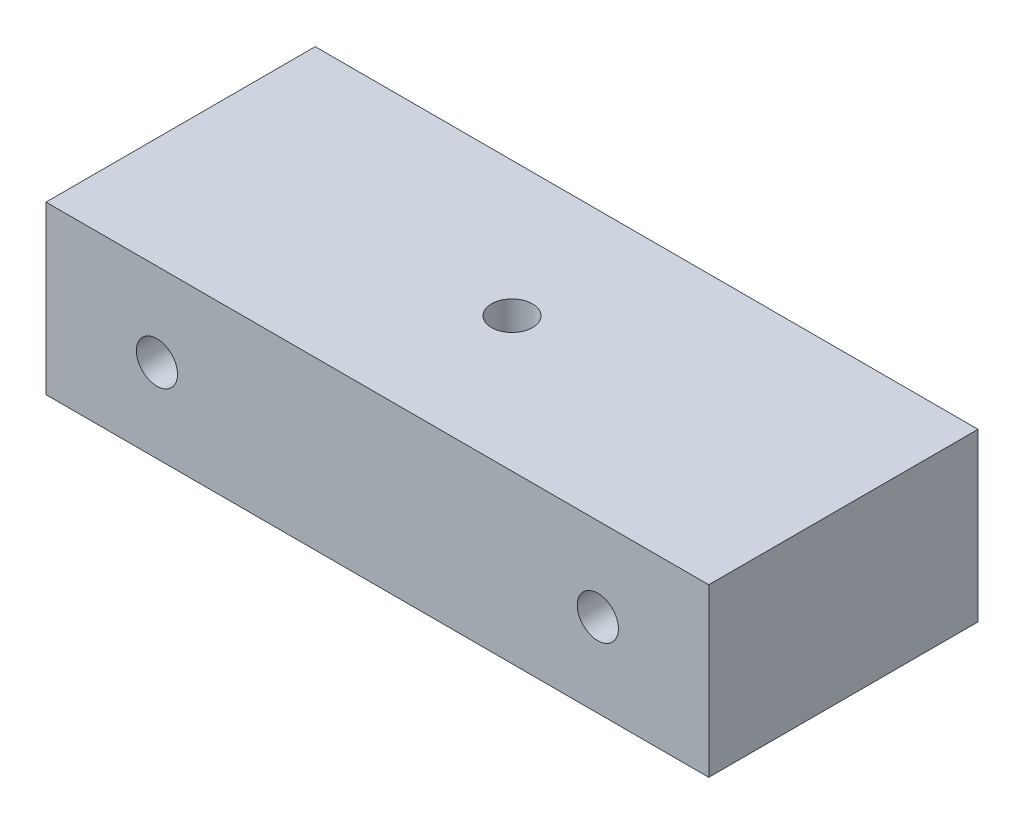
ISO-10303-21;
HEADER;
FILE_DESCRIPTION(('STEP AP214'),'2;1');
FILE_NAME('part.step','',(''),(''),'','','');
FILE_SCHEMA(('AUTOMOTIVE_DESIGN { 1 0 10303 214 1 1 1 1 }'));
ENDSEC;
DATA;
#1=APPLICATION_CONTEXT('core data for automotive mechanical design processes');
#2=APPLICATION_PROTOCOL_DEFINITION('international standard','automotive_design',2000,#1);
#3=PRODUCT_CONTEXT('',#1,'mechanical');
#4=PRODUCT('Part','Part','',(#3));
#5=PRODUCT_RELATED_PRODUCT_CATEGORY('part','',(#4));
#6=PRODUCT_DEFINITION_FORMATION('','',#4);
#7=PRODUCT_DEFINITION_CONTEXT('part definition',#1,'design');
#8=PRODUCT_DEFINITION('design','',#6,#7);
#9=PRODUCT_DEFINITION_SHAPE('','',#8);
#10=(LENGTH_UNIT() NAMED_UNIT(*) SI_UNIT(.MILLI.,.METRE.));
#11=(NAMED_UNIT(*) PLANE_ANGLE_UNIT() SI_UNIT($,.RADIAN.));
#12=(NAMED_UNIT(*) SI_UNIT($,.STERADIAN.) SOLID_ANGLE_UNIT());
#13=UNCERTAINTY_MEASURE_WITH_UNIT(LENGTH_MEASURE(1.E-05),#10,'distance_accuracy_value','');
#14=(GEOMETRIC_REPRESENTATION_CONTEXT(3) GLOBAL_UNCERTAINTY_ASSIGNED_CONTEXT((#13)) GLOBAL_UNIT_ASSIGNED_CONTEXT((#10,
#11,#12)) REPRESENTATION_CONTEXT('',''));
#15=CARTESIAN_POINT('',(0.,0.,0.));
#16=DIRECTION('',(0.,0.,1.));
#17=DIRECTION('',(1.,0.,0.));
#18=AXIS2_PLACEMENT_3D('',#15,#16,#17);
#19=CARTESIAN_POINT('',(60.6717006100665,-154.017379901003,64.8762630190816));
#20=DIRECTION('',(-1.,0.,0.));
#21=DIRECTION('',(0.,0.,1.));
#22=AXIS2_PLACEMENT_3D('',#19,#20,#21);
#23=PLANE('',#22);
#24=DIRECTION('',(0.,1.,0.));
#25=VECTOR('',#24,1.);
#26=CARTESIAN_POINT('',(60.6717006100665,-154.017379901003,18.3699999999998));
#27=LINE('',#26,#25);
#28=CARTESIAN_POINT('',(60.6717006100665,-155.517379901003,18.3699999999998));
#29=VERTEX_POINT('',#28);
#30=CARTESIAN_POINT('',(60.6717006100665,-144.167379901003,18.3699999999998));
#31=VERTEX_POINT('',#30);
#32=EDGE_CURVE('E87',#29,#31,#27,.T.);
#33=ORIENTED_EDGE('',*,*,#32,.F.);
#34=DIRECTION('',(0.,0.,-1.));
#35=VECTOR('',#34,1.);
#36=CARTESIAN_POINT('',(60.6717006100665,-155.517379901003,64.8762630190816));
#37=LINE('',#36,#35);
#38=CARTESIAN_POINT('',(60.6717006100665,-155.517379901003,0.05));
#39=VERTEX_POINT('',#38);
#40=EDGE_CURVE('E53',#29,#39,#37,.T.);
#41=ORIENTED_EDGE('',*,*,#40,.T.);
#42=DIRECTION('',(0.,1.,0.));
#43=VECTOR('',#42,1.);
#44=CARTESIAN_POINT('',(60.6717006100665,-154.017379901003,0.05));
#45=LINE('',#44,#43);
#46=CARTESIAN_POINT('',(60.6717006100665,-144.167379901003,0.05));
#47=VERTEX_POINT('',#46);
#48=EDGE_CURVE('E84',#39,#47,#45,.T.);
#49=ORIENTED_EDGE('',*,*,#48,.T.);
#50=DIRECTION('',(0.,0.,-1.));
#51=VECTOR('',#50,1.);
#52=CARTESIAN_POINT('',(60.6717006100665,-144.167379901003,64.8762630190816));
#53=LINE('',#52,#51);
#54=EDGE_CURVE('E76',#31,#47,#53,.T.);
#55=ORIENTED_EDGE('',*,*,#54,.F.);
#56=EDGE_LOOP('',(#33,#41,#49,#55));
#57=FACE_BOUND('',#56,.T.);
#58=ADVANCED_FACE('F36',(#57),#23,.F.);
#59=CARTESIAN_POINT('',(60.6717006100665,-144.167379901003,64.8762630190816));
#60=DIRECTION('',(0.,-1.,0.));
#61=DIRECTION('',(0.,0.,-1.));
#62=AXIS2_PLACEMENT_3D('',#59,#60,#61);
#63=PLANE('',#62);
#64=CARTESIAN_POINT('',(38.1217006100664,-144.167379901003,9.2099999999999));
#65=DIRECTION('',(0.,1.,0.));
#66=DIRECTION('',(0.,0.,1.));
#67=AXIS2_PLACEMENT_3D('',#64,#65,#66);
#68=CIRCLE('',#67,1.4);
#69=CARTESIAN_POINT('',(38.1217006100664,-144.167379901003,10.6099999999999));
#70=VERTEX_POINT('',#69);
#71=EDGE_CURVE('E131',#70,#70,#68,.T.);
#72=ORIENTED_EDGE('',*,*,#71,.F.);
#73=EDGE_LOOP('',(#72));
#74=FACE_BOUND('',#73,.T.);
#75=DIRECTION('',(-1.,0.,0.));
#76=VECTOR('',#75,1.);
#77=CARTESIAN_POINT('',(60.6717006100665,-144.167379901003,18.3699999999998));
#78=LINE('',#77,#76);
#79=CARTESIAN_POINT('',(15.5717006100663,-144.167379901003,18.3699999999998));
#80=VERTEX_POINT('',#79);
#81=EDGE_CURVE('E45',#31,#80,#78,.T.);
#82=ORIENTED_EDGE('',*,*,#81,.F.);
#83=ORIENTED_EDGE('',*,*,#54,.T.);
#84=DIRECTION('',(-1.,0.,0.));
#85=VECTOR('',#84,1.);
#86=CARTESIAN_POINT('',(60.6717006100665,-144.167379901003,0.05));
#87=LINE('',#86,#85);
#88=CARTESIAN_POINT('',(15.5717006100663,-144.167379901003,0.05));
#89=VERTEX_POINT('',#88);
#90=EDGE_CURVE('E96',#47,#89,#87,.T.);
#91=ORIENTED_EDGE('',*,*,#90,.T.);
#92=DIRECTION('',(0.,0.,-1.));
#93=VECTOR('',#92,1.);
#94=CARTESIAN_POINT('',(15.5717006100663,-144.167379901003,64.8762630190816));
#95=LINE('',#94,#93);
#96=EDGE_CURVE('E111',#80,#89,#95,.T.);
#97=ORIENTED_EDGE('',*,*,#96,.F.);
#98=EDGE_LOOP('',(#82,#83,#91,#97));
#99=FACE_BOUND('',#98,.T.);
#100=ADVANCED_FACE('F139',(#74,#99),#63,.F.);
#101=CARTESIAN_POINT('',(15.5717006100663,-154.017379901003,64.8762630190816));
#102=DIRECTION('',(1.,0.,0.));
#103=DIRECTION('',(0.,1.,0.));
#104=AXIS2_PLACEMENT_3D('',#101,#102,#103);
#105=PLANE('',#104);
#106=DIRECTION('',(0.,-1.,0.));
#107=VECTOR('',#106,1.);
#108=CARTESIAN_POINT('',(15.5717006100663,-154.017379901003,18.3699999999998));
#109=LINE('',#108,#107);
#110=CARTESIAN_POINT('',(15.5717006100664,-155.517379901003,18.3699999999998));
#111=VERTEX_POINT('',#110);
#112=EDGE_CURVE('E11',#80,#111,#109,.T.);
#113=ORIENTED_EDGE('',*,*,#112,.F.);
#114=ORIENTED_EDGE('',*,*,#96,.T.);
#115=DIRECTION('',(0.,-1.,0.));
#116=VECTOR('',#115,1.);
#117=CARTESIAN_POINT('',(15.5717006100663,-154.017379901003,0.05));
#118=LINE('',#117,#116);
#119=CARTESIAN_POINT('',(15.5717006100664,-155.517379901003,0.05));
#120=VERTEX_POINT('',#119);
#121=EDGE_CURVE('E104',#89,#120,#118,.T.);
#122=ORIENTED_EDGE('',*,*,#121,.T.);
#123=DIRECTION('',(0.,0.,-1.));
#124=VECTOR('',#123,1.);
#125=CARTESIAN_POINT('',(15.5717006100664,-155.517379901003,64.8762630190816));
#126=LINE('',#125,#124);
#127=EDGE_CURVE('E59',#111,#120,#126,.T.);
#128=ORIENTED_EDGE('',*,*,#127,.F.);
#129=EDGE_LOOP('',(#113,#114,#122,#128));
#130=FACE_BOUND('',#129,.T.);
#131=ADVANCED_FACE('F141',(#130),#105,.F.);
#132=CARTESIAN_POINT('',(15.5717006100664,-155.517379901003,64.8762630190816));
#133=DIRECTION('',(0.,1.,0.));
#134=DIRECTION('',(0.,0.,1.));
#135=AXIS2_PLACEMENT_3D('',#132,#133,#134);
#136=PLANE('',#135);
#137=CARTESIAN_POINT('',(38.1217006100664,-155.517379901003,9.2099999999999));
#138=DIRECTION('',(0.,1.,0.));
#139=DIRECTION('',(0.,0.,1.));
#140=AXIS2_PLACEMENT_3D('',#137,#138,#139);
#141=CIRCLE('',#140,1.4);
#142=CARTESIAN_POINT('',(38.1217006100664,-155.517379901003,10.6099999999999));
#143=VERTEX_POINT('',#142);
#144=EDGE_CURVE('E127',#143,#143,#141,.T.);
#145=ORIENTED_EDGE('',*,*,#144,.T.);
#146=EDGE_LOOP('',(#145));
#147=FACE_BOUND('',#146,.T.);
#148=DIRECTION('',(1.,0.,0.));
#149=VECTOR('',#148,1.);
#150=CARTESIAN_POINT('',(15.5717006100663,-155.517379901003,18.3699999999998));
#151=LINE('',#150,#149);
#152=EDGE_CURVE('E100',#111,#29,#151,.T.);
#153=ORIENTED_EDGE('',*,*,#152,.F.);
#154=ORIENTED_EDGE('',*,*,#127,.T.);
#155=DIRECTION('',(1.,0.,0.));
#156=VECTOR('',#155,1.);
#157=CARTESIAN_POINT('',(15.5717006100664,-155.517379901003,0.05));
#158=LINE('',#157,#156);
#159=EDGE_CURVE('E95',#120,#39,#158,.T.);
#160=ORIENTED_EDGE('',*,*,#159,.T.);
#161=ORIENTED_EDGE('',*,*,#40,.F.);
#162=EDGE_LOOP('',(#153,#154,#160,#161));
#163=FACE_BOUND('',#162,.T.);
#164=ADVANCED_FACE('F98',(#147,#163),#136,.F.);
#165=CARTESIAN_POINT('',(0.,0.,0.05));
#166=DIRECTION('',(0.,0.,1.));
#167=DIRECTION('',(1.,0.,0.));
#168=AXIS2_PLACEMENT_3D('',#165,#166,#167);
#169=PLANE('',#168);
#170=CARTESIAN_POINT('',(53.1217006100664,-149.842379901003,0.0500000000000014));
#171=DIRECTION('',(0.,0.,1.));
#172=DIRECTION('',(1.,0.,0.));
#173=AXIS2_PLACEMENT_3D('',#170,#171,#172);
#174=CIRCLE('',#173,1.4);
#175=CARTESIAN_POINT('',(54.5217006100664,-149.842379901003,0.0500000000000014));
#176=VERTEX_POINT('',#175);
#177=EDGE_CURVE('E123',#176,#176,#174,.T.);
#178=ORIENTED_EDGE('',*,*,#177,.T.);
#179=EDGE_LOOP('',(#178));
#180=FACE_BOUND('',#179,.T.);
#181=CARTESIAN_POINT('',(23.1217006100664,-149.842379901003,0.0500000000000014));
#182=DIRECTION('',(0.,0.,1.));
#183=DIRECTION('',(1.,0.,0.));
#184=AXIS2_PLACEMENT_3D('',#181,#182,#183);
#185=CIRCLE('',#184,1.40000000000001);
#186=CARTESIAN_POINT('',(24.5217006100665,-149.842379901003,0.0500000000000014));
#187=VERTEX_POINT('',#186);
#188=EDGE_CURVE('E108',#187,#187,#185,.T.);
#189=ORIENTED_EDGE('',*,*,#188,.T.);
#190=EDGE_LOOP('',(#189));
#191=FACE_BOUND('',#190,.T.);
#192=ORIENTED_EDGE('',*,*,#48,.F.);
#193=ORIENTED_EDGE('',*,*,#159,.F.);
#194=ORIENTED_EDGE('',*,*,#121,.F.);
#195=ORIENTED_EDGE('',*,*,#90,.F.);
#196=EDGE_LOOP('',(#192,#193,#194,#195));
#197=FACE_BOUND('',#196,.T.);
#198=ADVANCED_FACE('F93',(#180,#191,#197),#169,.F.);
#199=CARTESIAN_POINT('',(1.10876030579021E-13,-155.517379901003,18.3699999999998));
#200=DIRECTION('',(0.,0.,1.));
#201=DIRECTION('',(0.,1.,0.));
#202=AXIS2_PLACEMENT_3D('',#199,#200,#201);
#203=PLANE('',#202);
#204=CARTESIAN_POINT('',(53.1217006100664,-149.842379901003,18.3699999999998));
#205=DIRECTION('',(0.,0.,1.));
#206=DIRECTION('',(0.,-1.,0.));
#207=AXIS2_PLACEMENT_3D('',#204,#205,#206);
#208=CIRCLE('',#207,1.4);
#209=CARTESIAN_POINT('',(53.1217006100664,-151.242379901003,18.3699999999998));
#210=VERTEX_POINT('',#209);
#211=EDGE_CURVE('E40',#210,#210,#208,.T.);
#212=ORIENTED_EDGE('',*,*,#211,.F.);
#213=EDGE_LOOP('',(#212));
#214=FACE_BOUND('',#213,.T.);
#215=CARTESIAN_POINT('',(23.1217006100664,-149.842379901003,18.3699999999998));
#216=DIRECTION('',(0.,0.,1.));
#217=DIRECTION('',(0.,-1.,0.));
#218=AXIS2_PLACEMENT_3D('',#215,#216,#217);
#219=CIRCLE('',#218,1.40000000000001);
#220=CARTESIAN_POINT('',(23.1217006100664,-151.242379901003,18.3699999999998));
#221=VERTEX_POINT('',#220);
#222=EDGE_CURVE('E89',#221,#221,#219,.T.);
#223=ORIENTED_EDGE('',*,*,#222,.F.);
#224=EDGE_LOOP('',(#223));
#225=FACE_BOUND('',#224,.T.);
#226=ORIENTED_EDGE('',*,*,#152,.T.);
#227=ORIENTED_EDGE('',*,*,#32,.T.);
#228=ORIENTED_EDGE('',*,*,#81,.T.);
#229=ORIENTED_EDGE('',*,*,#112,.T.);
#230=EDGE_LOOP('',(#226,#227,#228,#229));
#231=FACE_BOUND('',#230,.T.);
#232=ADVANCED_FACE('F38',(#214,#225,#231),#203,.T.);
#233=CARTESIAN_POINT('',(23.1217006100664,-149.842379901003,0.0500000000000014));
#234=DIRECTION('',(0.,0.,1.));
#235=DIRECTION('',(1.,0.,0.));
#236=AXIS2_PLACEMENT_3D('',#233,#234,#235);
#237=CYLINDRICAL_SURFACE('',#236,1.40000000000001);
#238=ORIENTED_EDGE('',*,*,#222,.T.);
#239=EDGE_LOOP('',(#238));
#240=FACE_BOUND('',#239,.T.);
#241=ORIENTED_EDGE('',*,*,#188,.F.);
#242=EDGE_LOOP('',(#241));
#243=FACE_BOUND('',#242,.T.);
#244=ADVANCED_FACE('F155',(#240,#243),#237,.F.);
#245=CARTESIAN_POINT('',(53.1217006100664,-149.842379901003,0.0500000000000014));
#246=DIRECTION('',(0.,0.,1.));
#247=DIRECTION('',(1.,0.,0.));
#248=AXIS2_PLACEMENT_3D('',#245,#246,#247);
#249=CYLINDRICAL_SURFACE('',#248,1.4);
#250=ORIENTED_EDGE('',*,*,#211,.T.);
#251=EDGE_LOOP('',(#250));
#252=FACE_BOUND('',#251,.T.);
#253=ORIENTED_EDGE('',*,*,#177,.F.);
#254=EDGE_LOOP('',(#253));
#255=FACE_BOUND('',#254,.T.);
#256=ADVANCED_FACE('F158',(#252,#255),#249,.F.);
#257=CARTESIAN_POINT('',(38.1217006100664,-155.517379901003,9.2099999999999));
#258=DIRECTION('',(0.,1.,0.));
#259=DIRECTION('',(0.,0.,1.));
#260=AXIS2_PLACEMENT_3D('',#257,#258,#259);
#261=CYLINDRICAL_SURFACE('',#260,1.4);
#262=CARTESIAN_POINT('',(38.1217006100664,-155.517379901003,10.6099999999999));
#263=CARTESIAN_POINT('',(38.1217006100664,-155.399150734336,10.6099999999999));
#264=CARTESIAN_POINT('',(38.1217006100664,-155.280921567669,10.6099999999999));
#265=CARTESIAN_POINT('',(38.1217006100664,-155.044463234336,10.6099999999999));
#266=CARTESIAN_POINT('',(38.1217006100664,-154.926234067669,10.6099999999999));
#267=CARTESIAN_POINT('',(38.1217006100664,-154.689775734336,10.6099999999999));
#268=CARTESIAN_POINT('',(38.1217006100664,-154.571546567669,10.6099999999999));
#269=CARTESIAN_POINT('',(38.1217006100664,-154.335088234336,10.6099999999999));
#270=CARTESIAN_POINT('',(38.1217006100664,-154.216859067669,10.6099999999999));
#271=CARTESIAN_POINT('',(38.1217006100664,-153.980400734336,10.6099999999999));
#272=CARTESIAN_POINT('',(38.1217006100664,-153.862171567669,10.6099999999999));
#273=CARTESIAN_POINT('',(38.1217006100664,-153.625713234336,10.6099999999999));
#274=CARTESIAN_POINT('',(38.1217006100664,-153.507484067669,10.6099999999999));
#275=CARTESIAN_POINT('',(38.1217006100664,-153.271025734336,10.6099999999999));
#276=CARTESIAN_POINT('',(38.1217006100664,-153.152796567669,10.6099999999999));
#277=CARTESIAN_POINT('',(38.1217006100664,-152.916338234336,10.6099999999999));
#278=CARTESIAN_POINT('',(38.1217006100664,-152.798109067669,10.6099999999999));
#279=CARTESIAN_POINT('',(38.1217006100664,-152.561650734336,10.6099999999999));
#280=CARTESIAN_POINT('',(38.1217006100664,-152.443421567669,10.6099999999999));
#281=CARTESIAN_POINT('',(38.1217006100664,-152.206963234336,10.6099999999999));
#282=CARTESIAN_POINT('',(38.1217006100664,-152.088734067669,10.6099999999999));
#283=CARTESIAN_POINT('',(38.1217006100664,-151.852275734336,10.6099999999999));
#284=CARTESIAN_POINT('',(38.1217006100664,-151.734046567669,10.6099999999999));
#285=CARTESIAN_POINT('',(38.1217006100664,-151.497588234336,10.6099999999999));
#286=CARTESIAN_POINT('',(38.1217006100664,-151.379359067669,10.6099999999999));
#287=CARTESIAN_POINT('',(38.1217006100664,-151.142900734336,10.6099999999999));
#288=CARTESIAN_POINT('',(38.1217006100664,-151.024671567669,10.6099999999999));
#289=CARTESIAN_POINT('',(38.1217006100664,-150.788213234336,10.6099999999999));
#290=CARTESIAN_POINT('',(38.1217006100664,-150.669984067669,10.6099999999999));
#291=CARTESIAN_POINT('',(38.1217006100664,-150.433525734336,10.6099999999999));
#292=CARTESIAN_POINT('',(38.1217006100664,-150.315296567669,10.6099999999999));
#293=CARTESIAN_POINT('',(38.1217006100664,-150.078838234336,10.6099999999999));
#294=CARTESIAN_POINT('',(38.1217006100664,-149.960609067669,10.6099999999999));
#295=CARTESIAN_POINT('',(38.1217006100664,-149.724150734336,10.6099999999999));
#296=CARTESIAN_POINT('',(38.1217006100664,-149.605921567669,10.6099999999999));
#297=CARTESIAN_POINT('',(38.1217006100664,-149.369463234336,10.6099999999999));
#298=CARTESIAN_POINT('',(38.1217006100664,-149.251234067669,10.6099999999999));
#299=CARTESIAN_POINT('',(38.1217006100664,-149.014775734336,10.6099999999999));
#300=CARTESIAN_POINT('',(38.1217006100664,-148.896546567669,10.6099999999999));
#301=CARTESIAN_POINT('',(38.1217006100664,-148.660088234336,10.6099999999999));
#302=CARTESIAN_POINT('',(38.1217006100664,-148.541859067669,10.6099999999999));
#303=CARTESIAN_POINT('',(38.1217006100664,-148.305400734336,10.6099999999999));
#304=CARTESIAN_POINT('',(38.1217006100664,-148.187171567669,10.6099999999999));
#305=CARTESIAN_POINT('',(38.1217006100664,-147.950713234336,10.6099999999999));
#306=CARTESIAN_POINT('',(38.1217006100664,-147.832484067669,10.6099999999999));
#307=CARTESIAN_POINT('',(38.1217006100664,-147.596025734336,10.6099999999999));
#308=CARTESIAN_POINT('',(38.1217006100664,-147.477796567669,10.6099999999999));
#309=CARTESIAN_POINT('',(38.1217006100664,-147.241338234336,10.6099999999999));
#310=CARTESIAN_POINT('',(38.1217006100664,-147.123109067669,10.6099999999999));
#311=CARTESIAN_POINT('',(38.1217006100664,-146.886650734336,10.6099999999999));
#312=CARTESIAN_POINT('',(38.1217006100664,-146.768421567669,10.6099999999999));
#313=CARTESIAN_POINT('',(38.1217006100664,-146.531963234336,10.6099999999999));
#314=CARTESIAN_POINT('',(38.1217006100664,-146.413734067669,10.6099999999999));
#315=CARTESIAN_POINT('',(38.1217006100664,-146.177275734336,10.6099999999999));
#316=CARTESIAN_POINT('',(38.1217006100664,-146.059046567669,10.6099999999999));
#317=CARTESIAN_POINT('',(38.1217006100664,-145.822588234336,10.6099999999999));
#318=CARTESIAN_POINT('',(38.1217006100664,-145.704359067669,10.6099999999999));
#319=CARTESIAN_POINT('',(38.1217006100664,-145.467900734336,10.6099999999999));
#320=CARTESIAN_POINT('',(38.1217006100664,-145.349671567669,10.6099999999999));
#321=CARTESIAN_POINT('',(38.1217006100664,-145.113213234336,10.6099999999999));
#322=CARTESIAN_POINT('',(38.1217006100664,-144.994984067669,10.6099999999999));
#323=CARTESIAN_POINT('',(38.1217006100664,-144.758525734336,10.6099999999999));
#324=CARTESIAN_POINT('',(38.1217006100664,-144.640296567669,10.6099999999999));
#325=CARTESIAN_POINT('',(38.1217006100664,-144.403838234336,10.6099999999999));
#326=CARTESIAN_POINT('',(38.1217006100664,-144.285609067669,10.6099999999999));
#327=CARTESIAN_POINT('',(38.1217006100664,-144.167379901003,10.6099999999999));
#328=B_SPLINE_CURVE_WITH_KNOTS('',3,(#262,#263,#264,#265,#266,#267,#268,#269,#270,#271,#272,
#273,#274,#275,#276,#277,#278,#279,#280,#281,#282,#283,#284,#285,#286,#287,#288,#289,#290,#291,
#292,#293,#294,#295,#296,#297,#298,#299,#300,#301,#302,#303,#304,#305,#306,#307,#308,#309,#310,
#311,#312,#313,#314,#315,#316,#317,#318,#319,#320,#321,#322,#323,#324,#325,#326,#327),
.UNSPECIFIED.,.F.,.F.,(4,2,2,2,2,2,2,2,2,2,2,2,2,2,2,2,2,2,2,2,2,2,2,2,2,2,2,2,2,2,2,2,4),(0.,
0.354687500000006,0.709375000000012,1.06406250000002,1.41875000000002,1.77343750000003,
2.12812500000004,2.48281250000004,2.83750000000005,3.19218750000003,3.54687500000003,
3.90156250000004,4.25625000000004,4.61093750000005,4.96562500000006,5.32031250000006,
5.67500000000007,6.02968750000005,6.38437500000005,6.73906250000006,7.09375000000007,
7.44843750000007,7.80312500000008,8.15781250000008,8.51250000000009,8.86718750000007,
9.22187500000007,9.57656250000008,9.93125000000009,10.2859375000001,10.6406250000001,
10.9953125000001,11.3500000000001),.UNSPECIFIED.);
#329=EDGE_CURVE('BSEAM137',#143,#70,#328,.T.);
#330=ORIENTED_EDGE('',*,*,#144,.F.);
#331=ORIENTED_EDGE('',*,*,#71,.T.);
#332=ORIENTED_EDGE('',*,*,#329,.T.);
#333=ORIENTED_EDGE('',*,*,#329,.F.);
#334=EDGE_LOOP('',(#330,#332,#331,#333));
#335=FACE_BOUND('',#334,.T.);
#336=ADVANCED_FACE('F137',(#335),#261,.F.);
#337=CLOSED_SHELL('',(#58,#100,#131,#164,#198,#232,#244,#256,#336));
#338=MANIFOLD_SOLID_BREP('B2',#337);
#339=ADVANCED_BREP_SHAPE_REPRESENTATION('',(#18,#338),#14);
#340=SHAPE_DEFINITION_REPRESENTATION(#9,#339);
ENDSEC;
END-ISO-10303-21;
